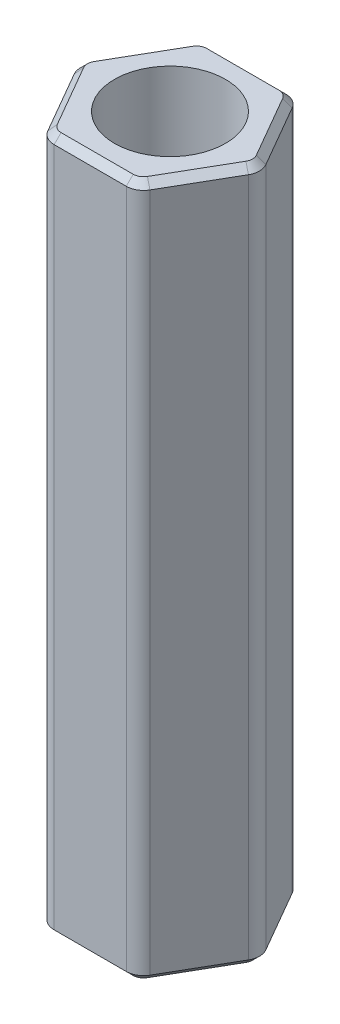
ISO-10303-21;
HEADER;
FILE_DESCRIPTION(('STEP AP214'),'2;1');
FILE_NAME('part.step','',(''),(''),'','','');
FILE_SCHEMA(('AUTOMOTIVE_DESIGN { 1 0 10303 214 1 1 1 1 }'));
ENDSEC;
DATA;
#1=APPLICATION_CONTEXT('core data for automotive mechanical design processes');
#2=APPLICATION_PROTOCOL_DEFINITION('international standard','automotive_design',2000,#1);
#3=PRODUCT_CONTEXT('',#1,'mechanical');
#4=PRODUCT('Part','Part','',(#3));
#5=PRODUCT_RELATED_PRODUCT_CATEGORY('part','',(#4));
#6=PRODUCT_DEFINITION_FORMATION('','',#4);
#7=PRODUCT_DEFINITION_CONTEXT('part definition',#1,'design');
#8=PRODUCT_DEFINITION('design','',#6,#7);
#9=PRODUCT_DEFINITION_SHAPE('','',#8);
#10=(LENGTH_UNIT() NAMED_UNIT(*) SI_UNIT(.MILLI.,.METRE.));
#11=(NAMED_UNIT(*) PLANE_ANGLE_UNIT() SI_UNIT($,.RADIAN.));
#12=(NAMED_UNIT(*) SI_UNIT($,.STERADIAN.) SOLID_ANGLE_UNIT());
#13=UNCERTAINTY_MEASURE_WITH_UNIT(LENGTH_MEASURE(1.E-05),#10,'distance_accuracy_value','');
#14=(GEOMETRIC_REPRESENTATION_CONTEXT(3) GLOBAL_UNCERTAINTY_ASSIGNED_CONTEXT((#13)) GLOBAL_UNIT_ASSIGNED_CONTEXT((#10,
#11,#12)) REPRESENTATION_CONTEXT('',''));
#15=CARTESIAN_POINT('',(0.,0.,0.));
#16=DIRECTION('',(0.,0.,1.));
#17=DIRECTION('',(1.,0.,0.));
#18=AXIS2_PLACEMENT_3D('',#15,#16,#17);
#19=CARTESIAN_POINT('',(-1.32790561913614,20.,2.3));
#20=DIRECTION('',(0.,0.,-1.));
#21=DIRECTION('',(-1.,0.,0.));
#22=AXIS2_PLACEMENT_3D('',#19,#20,#21);
#23=PLANE('',#22);
#24=DIRECTION('',(0.,-1.,0.));
#25=VECTOR('',#24,1.);
#26=CARTESIAN_POINT('',(1.03923048454133,20.,2.3));
#27=LINE('',#26,#25);
#28=CARTESIAN_POINT('',(1.03923048454133,0.200000000000002,2.3));
#29=VERTEX_POINT('',#28);
#30=CARTESIAN_POINT('',(1.03923048454133,19.8,2.3));
#31=VERTEX_POINT('',#30);
#32=EDGE_CURVE('E1073',#29,#31,#27,.F.);
#33=ORIENTED_EDGE('',*,*,#32,.T.);
#34=DIRECTION('',(-1.,0.,0.));
#35=VECTOR('',#34,1.);
#36=CARTESIAN_POINT('',(-1.03923048454132,19.8,2.3));
#37=LINE('',#36,#35);
#38=CARTESIAN_POINT('',(-1.03923048454132,19.8,2.3));
#39=VERTEX_POINT('',#38);
#40=EDGE_CURVE('E308',#31,#39,#37,.T.);
#41=ORIENTED_EDGE('',*,*,#40,.T.);
#42=DIRECTION('',(0.,-1.,0.));
#43=VECTOR('',#42,1.);
#44=CARTESIAN_POINT('',(-1.03923048454132,20.,2.3));
#45=LINE('',#44,#43);
#46=CARTESIAN_POINT('',(-1.03923048454132,0.200000000000002,2.3));
#47=VERTEX_POINT('',#46);
#48=EDGE_CURVE('E1078',#39,#47,#45,.T.);
#49=ORIENTED_EDGE('',*,*,#48,.T.);
#50=DIRECTION('',(1.,0.,0.));
#51=VECTOR('',#50,1.);
#52=CARTESIAN_POINT('',(-1.32790561913614,0.200000000000002,2.3));
#53=LINE('',#52,#51);
#54=EDGE_CURVE('E305',#47,#29,#53,.T.);
#55=ORIENTED_EDGE('',*,*,#54,.T.);
#56=EDGE_LOOP('',(#33,#41,#49,#55));
#57=FACE_BOUND('',#56,.T.);
#58=ADVANCED_FACE('F45',(#57),#23,.F.);
#59=CARTESIAN_POINT('',(1.32790561913614,20.,2.3));
#60=DIRECTION('',(-0.866025403784439,0.,-0.5));
#61=DIRECTION('',(-0.5,0.,0.866025403784439));
#62=AXIS2_PLACEMENT_3D('',#59,#60,#61);
#63=PLANE('',#62);
#64=DIRECTION('',(0.,-1.,0.));
#65=VECTOR('',#64,1.);
#66=CARTESIAN_POINT('',(2.51147367097487,20.,0.25));
#67=LINE('',#66,#65);
#68=CARTESIAN_POINT('',(2.51147367097487,0.200000000000002,0.25));
#69=VERTEX_POINT('',#68);
#70=CARTESIAN_POINT('',(2.51147367097487,19.8,0.25));
#71=VERTEX_POINT('',#70);
#72=EDGE_CURVE('E242',#69,#71,#67,.F.);
#73=ORIENTED_EDGE('',*,*,#72,.T.);
#74=DIRECTION('',(-0.5,0.,0.866025403784439));
#75=VECTOR('',#74,1.);
#76=CARTESIAN_POINT('',(1.47224318643355,19.8,2.05));
#77=LINE('',#76,#75);
#78=CARTESIAN_POINT('',(1.47224318643355,19.8,2.05));
#79=VERTEX_POINT('',#78);
#80=EDGE_CURVE('E332',#71,#79,#77,.T.);
#81=ORIENTED_EDGE('',*,*,#80,.T.);
#82=DIRECTION('',(0.,-1.,0.));
#83=VECTOR('',#82,1.);
#84=CARTESIAN_POINT('',(1.47224318643355,20.,2.05));
#85=LINE('',#84,#83);
#86=CARTESIAN_POINT('',(1.47224318643355,0.200000000000002,2.05));
#87=VERTEX_POINT('',#86);
#88=EDGE_CURVE('E248',#79,#87,#85,.T.);
#89=ORIENTED_EDGE('',*,*,#88,.T.);
#90=DIRECTION('',(0.5,0.,-0.866025403784439));
#91=VECTOR('',#90,1.);
#92=CARTESIAN_POINT('',(1.32790561913614,0.200000000000002,2.3));
#93=LINE('',#92,#91);
#94=EDGE_CURVE('E329',#87,#69,#93,.T.);
#95=ORIENTED_EDGE('',*,*,#94,.T.);
#96=EDGE_LOOP('',(#73,#81,#89,#95));
#97=FACE_BOUND('',#96,.T.);
#98=ADVANCED_FACE('F510',(#97),#63,.F.);
#99=CARTESIAN_POINT('',(2.65581123827228,20.,0.));
#100=DIRECTION('',(-0.866025403784438,0.,0.5));
#101=DIRECTION('',(0.5,0.,0.866025403784438));
#102=AXIS2_PLACEMENT_3D('',#99,#100,#101);
#103=PLANE('',#102);
#104=DIRECTION('',(0.,-1.,0.));
#105=VECTOR('',#104,1.);
#106=CARTESIAN_POINT('',(1.47224318643354,20.,-2.05));
#107=LINE('',#106,#105);
#108=CARTESIAN_POINT('',(1.47224318643354,0.200000000000002,-2.05));
#109=VERTEX_POINT('',#108);
#110=CARTESIAN_POINT('',(1.47224318643354,19.8,-2.05));
#111=VERTEX_POINT('',#110);
#112=EDGE_CURVE('E482',#109,#111,#107,.F.);
#113=ORIENTED_EDGE('',*,*,#112,.T.);
#114=DIRECTION('',(0.5,0.,0.866025403784438));
#115=VECTOR('',#114,1.);
#116=CARTESIAN_POINT('',(2.51147367097487,19.8,-0.25));
#117=LINE('',#116,#115);
#118=CARTESIAN_POINT('',(2.51147367097487,19.8,-0.25));
#119=VERTEX_POINT('',#118);
#120=EDGE_CURVE('E349',#111,#119,#117,.T.);
#121=ORIENTED_EDGE('',*,*,#120,.T.);
#122=DIRECTION('',(0.,-1.,0.));
#123=VECTOR('',#122,1.);
#124=CARTESIAN_POINT('',(2.51147367097487,20.,-0.25));
#125=LINE('',#124,#123);
#126=CARTESIAN_POINT('',(2.51147367097487,0.200000000000002,-0.25));
#127=VERTEX_POINT('',#126);
#128=EDGE_CURVE('E494',#119,#127,#125,.T.);
#129=ORIENTED_EDGE('',*,*,#128,.T.);
#130=DIRECTION('',(-0.5,0.,-0.866025403784438));
#131=VECTOR('',#130,1.);
#132=CARTESIAN_POINT('',(2.65581123827228,0.200000000000002,0.));
#133=LINE('',#132,#131);
#134=EDGE_CURVE('E346',#127,#109,#133,.T.);
#135=ORIENTED_EDGE('',*,*,#134,.T.);
#136=EDGE_LOOP('',(#113,#121,#129,#135));
#137=FACE_BOUND('',#136,.T.);
#138=ADVANCED_FACE('F535',(#137),#103,.F.);
#139=CARTESIAN_POINT('',(1.32790561913614,20.,-2.3));
#140=DIRECTION('',(0.,0.,1.));
#141=DIRECTION('',(1.,0.,0.));
#142=AXIS2_PLACEMENT_3D('',#139,#140,#141);
#143=PLANE('',#142);
#144=DIRECTION('',(0.,-1.,0.));
#145=VECTOR('',#144,1.);
#146=CARTESIAN_POINT('',(-1.03923048454133,20.,-2.3));
#147=LINE('',#146,#145);
#148=CARTESIAN_POINT('',(-1.03923048454133,0.200000000000002,-2.3));
#149=VERTEX_POINT('',#148);
#150=CARTESIAN_POINT('',(-1.03923048454133,19.8,-2.3));
#151=VERTEX_POINT('',#150);
#152=EDGE_CURVE('E489',#149,#151,#147,.F.);
#153=ORIENTED_EDGE('',*,*,#152,.T.);
#154=DIRECTION('',(1.,0.,0.));
#155=VECTOR('',#154,1.);
#156=CARTESIAN_POINT('',(1.03923048454133,19.8,-2.3));
#157=LINE('',#156,#155);
#158=CARTESIAN_POINT('',(1.03923048454133,19.8,-2.3));
#159=VERTEX_POINT('',#158);
#160=EDGE_CURVE('E282',#151,#159,#157,.T.);
#161=ORIENTED_EDGE('',*,*,#160,.T.);
#162=DIRECTION('',(0.,-1.,0.));
#163=VECTOR('',#162,1.);
#164=CARTESIAN_POINT('',(1.03923048454133,20.,-2.3));
#165=LINE('',#164,#163);
#166=CARTESIAN_POINT('',(1.03923048454133,0.200000000000002,-2.3));
#167=VERTEX_POINT('',#166);
#168=EDGE_CURVE('E480',#159,#167,#165,.T.);
#169=ORIENTED_EDGE('',*,*,#168,.T.);
#170=DIRECTION('',(-1.,0.,0.));
#171=VECTOR('',#170,1.);
#172=CARTESIAN_POINT('',(1.32790561913614,0.200000000000002,-2.3));
#173=LINE('',#172,#171);
#174=EDGE_CURVE('E279',#167,#149,#173,.T.);
#175=ORIENTED_EDGE('',*,*,#174,.T.);
#176=EDGE_LOOP('',(#153,#161,#169,#175));
#177=FACE_BOUND('',#176,.T.);
#178=ADVANCED_FACE('F485',(#177),#143,.F.);
#179=CARTESIAN_POINT('',(-1.32790561913614,20.,-2.3));
#180=DIRECTION('',(0.866025403784439,0.,0.5));
#181=DIRECTION('',(0.5,0.,-0.866025403784439));
#182=AXIS2_PLACEMENT_3D('',#179,#180,#181);
#183=PLANE('',#182);
#184=DIRECTION('',(0.,-1.,0.));
#185=VECTOR('',#184,1.);
#186=CARTESIAN_POINT('',(-2.51147367097487,20.,-0.25));
#187=LINE('',#186,#185);
#188=CARTESIAN_POINT('',(-2.51147367097487,0.200000000000002,-0.25));
#189=VERTEX_POINT('',#188);
#190=CARTESIAN_POINT('',(-2.51147367097487,19.8,-0.25));
#191=VERTEX_POINT('',#190);
#192=EDGE_CURVE('E490',#189,#191,#187,.F.);
#193=ORIENTED_EDGE('',*,*,#192,.T.);
#194=DIRECTION('',(0.5,0.,-0.866025403784439));
#195=VECTOR('',#194,1.);
#196=CARTESIAN_POINT('',(-1.47224318643355,19.8,-2.05));
#197=LINE('',#196,#195);
#198=CARTESIAN_POINT('',(-1.47224318643355,19.8,-2.05));
#199=VERTEX_POINT('',#198);
#200=EDGE_CURVE('E314',#191,#199,#197,.T.);
#201=ORIENTED_EDGE('',*,*,#200,.T.);
#202=DIRECTION('',(0.,-1.,0.));
#203=VECTOR('',#202,1.);
#204=CARTESIAN_POINT('',(-1.47224318643355,20.,-2.05));
#205=LINE('',#204,#203);
#206=CARTESIAN_POINT('',(-1.47224318643355,0.200000000000002,-2.05));
#207=VERTEX_POINT('',#206);
#208=EDGE_CURVE('E497',#199,#207,#205,.T.);
#209=ORIENTED_EDGE('',*,*,#208,.T.);
#210=DIRECTION('',(-0.5,0.,0.866025403784439));
#211=VECTOR('',#210,1.);
#212=CARTESIAN_POINT('',(-1.32790561913614,0.200000000000002,-2.3));
#213=LINE('',#212,#211);
#214=EDGE_CURVE('E311',#207,#189,#213,.T.);
#215=ORIENTED_EDGE('',*,*,#214,.T.);
#216=EDGE_LOOP('',(#193,#201,#209,#215));
#217=FACE_BOUND('',#216,.T.);
#218=ADVANCED_FACE('F873',(#217),#183,.F.);
#219=CARTESIAN_POINT('',(-2.65581123827228,20.,0.));
#220=DIRECTION('',(0.866025403784438,0.,-0.5));
#221=DIRECTION('',(-0.5,0.,-0.866025403784438));
#222=AXIS2_PLACEMENT_3D('',#219,#220,#221);
#223=PLANE('',#222);
#224=DIRECTION('',(0.,-1.,0.));
#225=VECTOR('',#224,1.);
#226=CARTESIAN_POINT('',(-1.47224318643354,20.,2.05));
#227=LINE('',#226,#225);
#228=CARTESIAN_POINT('',(-1.47224318643354,0.200000000000002,2.05));
#229=VERTEX_POINT('',#228);
#230=CARTESIAN_POINT('',(-1.47224318643354,19.8,2.05));
#231=VERTEX_POINT('',#230);
#232=EDGE_CURVE('E1086',#229,#231,#227,.F.);
#233=ORIENTED_EDGE('',*,*,#232,.T.);
#234=DIRECTION('',(-0.5,0.,-0.866025403784438));
#235=VECTOR('',#234,1.);
#236=CARTESIAN_POINT('',(-2.51147367097487,19.8,0.25));
#237=LINE('',#236,#235);
#238=CARTESIAN_POINT('',(-2.51147367097487,19.8,0.25));
#239=VERTEX_POINT('',#238);
#240=EDGE_CURVE('E289',#231,#239,#237,.T.);
#241=ORIENTED_EDGE('',*,*,#240,.T.);
#242=DIRECTION('',(0.,-1.,0.));
#243=VECTOR('',#242,1.);
#244=CARTESIAN_POINT('',(-2.51147367097487,20.,0.25));
#245=LINE('',#244,#243);
#246=CARTESIAN_POINT('',(-2.51147367097487,0.200000000000002,0.25));
#247=VERTEX_POINT('',#246);
#248=EDGE_CURVE('E1082',#239,#247,#245,.T.);
#249=ORIENTED_EDGE('',*,*,#248,.T.);
#250=DIRECTION('',(0.5,0.,0.866025403784438));
#251=VECTOR('',#250,1.);
#252=CARTESIAN_POINT('',(-2.65581123827228,0.200000000000002,0.));
#253=LINE('',#252,#251);
#254=EDGE_CURVE('E286',#247,#229,#253,.T.);
#255=ORIENTED_EDGE('',*,*,#254,.T.);
#256=EDGE_LOOP('',(#233,#241,#249,#255));
#257=FACE_BOUND('',#256,.T.);
#258=ADVANCED_FACE('F863',(#257),#223,.F.);
#259=CARTESIAN_POINT('',(0.,20.,0.));
#260=DIRECTION('',(0.,1.,0.));
#261=DIRECTION('',(0.,0.,1.));
#262=AXIS2_PLACEMENT_3D('',#259,#260,#261);
#263=PLANE('',#262);
#264=DIRECTION('',(-0.5,0.,0.866025403784439));
#265=VECTOR('',#264,1.);
#266=CARTESIAN_POINT('',(-2.33826859021799,20.,-0.150000000000001));
#267=LINE('',#266,#265);
#268=CARTESIAN_POINT('',(-1.29903810567666,20.,-1.95));
#269=VERTEX_POINT('',#268);
#270=CARTESIAN_POINT('',(-2.33826859021799,20.,-0.150000000000001));
#271=VERTEX_POINT('',#270);
#272=EDGE_CURVE('E273',#269,#271,#267,.T.);
#273=ORIENTED_EDGE('',*,*,#272,.T.);
#274=CARTESIAN_POINT('',(-2.07846096908265,20.,0.));
#275=DIRECTION('',(0.,1.,0.));
#276=DIRECTION('',(0.,0.,1.));
#277=AXIS2_PLACEMENT_3D('',#274,#275,#276);
#278=CIRCLE('',#277,0.300000000000002);
#279=CARTESIAN_POINT('',(-2.33826859021799,20.,0.150000000000001));
#280=VERTEX_POINT('',#279);
#281=EDGE_CURVE('E276',#271,#280,#278,.T.);
#282=ORIENTED_EDGE('',*,*,#281,.T.);
#283=DIRECTION('',(0.5,0.,0.866025403784439));
#284=VECTOR('',#283,1.);
#285=CARTESIAN_POINT('',(-1.29903810567666,20.,1.95));
#286=LINE('',#285,#284);
#287=CARTESIAN_POINT('',(-1.29903810567666,20.,1.95));
#288=VERTEX_POINT('',#287);
#289=EDGE_CURVE('E263',#280,#288,#286,.T.);
#290=ORIENTED_EDGE('',*,*,#289,.T.);
#291=CARTESIAN_POINT('',(-1.03923048454132,20.,1.8));
#292=DIRECTION('',(0.,1.,0.));
#293=DIRECTION('',(0.,0.,1.));
#294=AXIS2_PLACEMENT_3D('',#291,#292,#293);
#295=CIRCLE('',#294,0.300000000000002);
#296=CARTESIAN_POINT('',(-1.03923048454132,20.,2.1));
#297=VERTEX_POINT('',#296);
#298=EDGE_CURVE('E260',#288,#297,#295,.T.);
#299=ORIENTED_EDGE('',*,*,#298,.T.);
#300=DIRECTION('',(1.,0.,0.));
#301=VECTOR('',#300,1.);
#302=CARTESIAN_POINT('',(1.03923048454133,20.,2.1));
#303=LINE('',#302,#301);
#304=CARTESIAN_POINT('',(1.03923048454133,20.,2.1));
#305=VERTEX_POINT('',#304);
#306=EDGE_CURVE('E257',#297,#305,#303,.T.);
#307=ORIENTED_EDGE('',*,*,#306,.T.);
#308=CARTESIAN_POINT('',(1.03923048454133,20.,1.8));
#309=DIRECTION('',(0.,1.,0.));
#310=DIRECTION('',(0.,0.,1.));
#311=AXIS2_PLACEMENT_3D('',#308,#309,#310);
#312=CIRCLE('',#311,0.300000000000002);
#313=CARTESIAN_POINT('',(1.29903810567666,20.,1.95));
#314=VERTEX_POINT('',#313);
#315=EDGE_CURVE('E254',#305,#314,#312,.T.);
#316=ORIENTED_EDGE('',*,*,#315,.T.);
#317=DIRECTION('',(0.5,0.,-0.866025403784439));
#318=VECTOR('',#317,1.);
#319=CARTESIAN_POINT('',(2.33826859021799,20.,0.150000000000001));
#320=LINE('',#319,#318);
#321=CARTESIAN_POINT('',(2.33826859021799,20.,0.150000000000001));
#322=VERTEX_POINT('',#321);
#323=EDGE_CURVE('E219',#314,#322,#320,.T.);
#324=ORIENTED_EDGE('',*,*,#323,.T.);
#325=CARTESIAN_POINT('',(2.07846096908265,20.,0.));
#326=DIRECTION('',(0.,1.,0.));
#327=DIRECTION('',(0.,0.,1.));
#328=AXIS2_PLACEMENT_3D('',#325,#326,#327);
#329=CIRCLE('',#328,0.300000000000002);
#330=CARTESIAN_POINT('',(2.33826859021799,20.,-0.150000000000001));
#331=VERTEX_POINT('',#330);
#332=EDGE_CURVE('E211',#322,#331,#329,.T.);
#333=ORIENTED_EDGE('',*,*,#332,.T.);
#334=DIRECTION('',(-0.5,0.,-0.866025403784438));
#335=VECTOR('',#334,1.);
#336=CARTESIAN_POINT('',(1.29903810567666,20.,-1.95));
#337=LINE('',#336,#335);
#338=CARTESIAN_POINT('',(1.29903810567666,20.,-1.95));
#339=VERTEX_POINT('',#338);
#340=EDGE_CURVE('E216',#331,#339,#337,.T.);
#341=ORIENTED_EDGE('',*,*,#340,.T.);
#342=CARTESIAN_POINT('',(1.03923048454133,20.,-1.8));
#343=DIRECTION('',(0.,1.,0.));
#344=DIRECTION('',(0.,0.,1.));
#345=AXIS2_PLACEMENT_3D('',#342,#343,#344);
#346=CIRCLE('',#345,0.300000000000002);
#347=CARTESIAN_POINT('',(1.03923048454133,20.,-2.1));
#348=VERTEX_POINT('',#347);
#349=EDGE_CURVE('E224',#339,#348,#346,.T.);
#350=ORIENTED_EDGE('',*,*,#349,.T.);
#351=DIRECTION('',(-1.,0.,0.));
#352=VECTOR('',#351,1.);
#353=CARTESIAN_POINT('',(-1.03923048454133,20.,-2.1));
#354=LINE('',#353,#352);
#355=CARTESIAN_POINT('',(-1.03923048454133,20.,-2.1));
#356=VERTEX_POINT('',#355);
#357=EDGE_CURVE('E266',#348,#356,#354,.T.);
#358=ORIENTED_EDGE('',*,*,#357,.T.);
#359=CARTESIAN_POINT('',(-1.03923048454133,20.,-1.8));
#360=DIRECTION('',(0.,1.,0.));
#361=DIRECTION('',(0.,0.,1.));
#362=AXIS2_PLACEMENT_3D('',#359,#360,#361);
#363=CIRCLE('',#362,0.300000000000002);
#364=EDGE_CURVE('E270',#356,#269,#363,.T.);
#365=ORIENTED_EDGE('',*,*,#364,.T.);
#366=EDGE_LOOP('',(#273,#282,#290,#299,#307,#316,#324,#333,#341,#350,#358,#365));
#367=FACE_BOUND('',#366,.T.);
#368=CARTESIAN_POINT('',(0.,20.,0.));
#369=DIRECTION('',(0.,1.,0.));
#370=DIRECTION('',(0.,0.,1.));
#371=AXIS2_PLACEMENT_3D('',#368,#369,#370);
#372=CIRCLE('',#371,1.6);
#373=CARTESIAN_POINT('',(0.,20.,1.6));
#374=VERTEX_POINT('',#373);
#375=EDGE_CURVE('E420',#374,#374,#372,.T.);
#376=ORIENTED_EDGE('',*,*,#375,.F.);
#377=EDGE_LOOP('',(#376));
#378=FACE_BOUND('',#377,.T.);
#379=ADVANCED_FACE('F213',(#367,#378),#263,.T.);
#380=CARTESIAN_POINT('',(0.,0.,0.));
#381=DIRECTION('',(0.,1.,0.));
#382=DIRECTION('',(0.,0.,1.));
#383=AXIS2_PLACEMENT_3D('',#380,#381,#382);
#384=PLANE('',#383);
#385=DIRECTION('',(-1.,0.,0.));
#386=VECTOR('',#385,1.);
#387=CARTESIAN_POINT('',(0.,0.,2.1));
#388=LINE('',#387,#386);
#389=CARTESIAN_POINT('',(1.03923048454133,0.,2.1));
#390=VERTEX_POINT('',#389);
#391=CARTESIAN_POINT('',(-1.03923048454132,0.,2.1));
#392=VERTEX_POINT('',#391);
#393=EDGE_CURVE('E71',#390,#392,#388,.T.);
#394=ORIENTED_EDGE('',*,*,#393,.T.);
#395=CARTESIAN_POINT('',(-1.03923048454132,0.,1.8));
#396=DIRECTION('',(0.,1.,0.));
#397=DIRECTION('',(0.,0.,1.));
#398=AXIS2_PLACEMENT_3D('',#395,#396,#397);
#399=CIRCLE('',#398,0.3);
#400=CARTESIAN_POINT('',(-1.29903810567666,0.,1.95));
#401=VERTEX_POINT('',#400);
#402=EDGE_CURVE('E11',#392,#401,#399,.F.);
#403=ORIENTED_EDGE('',*,*,#402,.T.);
#404=DIRECTION('',(-0.5,0.,-0.866025403784439));
#405=VECTOR('',#404,1.);
#406=CARTESIAN_POINT('',(-1.81865334794732,0.,1.05));
#407=LINE('',#406,#405);
#408=CARTESIAN_POINT('',(-2.33826859021798,0.,0.15));
#409=VERTEX_POINT('',#408);
#410=EDGE_CURVE('E56',#401,#409,#407,.T.);
#411=ORIENTED_EDGE('',*,*,#410,.T.);
#412=CARTESIAN_POINT('',(-2.07846096908265,0.,0.));
#413=DIRECTION('',(0.,1.,0.));
#414=DIRECTION('',(0.,0.,1.));
#415=AXIS2_PLACEMENT_3D('',#412,#413,#414);
#416=CIRCLE('',#415,0.3);
#417=CARTESIAN_POINT('',(-2.33826859021798,0.,-0.15));
#418=VERTEX_POINT('',#417);
#419=EDGE_CURVE('E376',#409,#418,#416,.F.);
#420=ORIENTED_EDGE('',*,*,#419,.T.);
#421=DIRECTION('',(0.5,0.,-0.866025403784439));
#422=VECTOR('',#421,1.);
#423=CARTESIAN_POINT('',(-1.81865334794732,0.,-1.05));
#424=LINE('',#423,#422);
#425=CARTESIAN_POINT('',(-1.29903810567666,0.,-1.95));
#426=VERTEX_POINT('',#425);
#427=EDGE_CURVE('E370',#418,#426,#424,.T.);
#428=ORIENTED_EDGE('',*,*,#427,.T.);
#429=CARTESIAN_POINT('',(-1.03923048454133,0.,-1.8));
#430=DIRECTION('',(0.,1.,0.));
#431=DIRECTION('',(0.,0.,1.));
#432=AXIS2_PLACEMENT_3D('',#429,#430,#431);
#433=CIRCLE('',#432,0.3);
#434=CARTESIAN_POINT('',(-1.03923048454133,0.,-2.1));
#435=VERTEX_POINT('',#434);
#436=EDGE_CURVE('E364',#426,#435,#433,.F.);
#437=ORIENTED_EDGE('',*,*,#436,.T.);
#438=DIRECTION('',(1.,0.,0.));
#439=VECTOR('',#438,1.);
#440=CARTESIAN_POINT('',(0.,0.,-2.1));
#441=LINE('',#440,#439);
#442=CARTESIAN_POINT('',(1.03923048454133,0.,-2.1));
#443=VERTEX_POINT('',#442);
#444=EDGE_CURVE('E358',#435,#443,#441,.T.);
#445=ORIENTED_EDGE('',*,*,#444,.T.);
#446=CARTESIAN_POINT('',(1.03923048454133,0.,-1.8));
#447=DIRECTION('',(0.,1.,0.));
#448=DIRECTION('',(0.,0.,1.));
#449=AXIS2_PLACEMENT_3D('',#446,#447,#448);
#450=CIRCLE('',#449,0.3);
#451=CARTESIAN_POINT('',(1.29903810567666,0.,-1.95));
#452=VERTEX_POINT('',#451);
#453=EDGE_CURVE('E352',#443,#452,#450,.F.);
#454=ORIENTED_EDGE('',*,*,#453,.T.);
#455=DIRECTION('',(0.5,0.,0.866025403784438));
#456=VECTOR('',#455,1.);
#457=CARTESIAN_POINT('',(1.81865334794732,0.,-1.05));
#458=LINE('',#457,#456);
#459=CARTESIAN_POINT('',(2.33826859021799,0.,-0.15));
#460=VERTEX_POINT('',#459);
#461=EDGE_CURVE('E355',#452,#460,#458,.T.);
#462=ORIENTED_EDGE('',*,*,#461,.T.);
#463=CARTESIAN_POINT('',(2.07846096908265,0.,0.));
#464=DIRECTION('',(0.,1.,0.));
#465=DIRECTION('',(0.,0.,1.));
#466=AXIS2_PLACEMENT_3D('',#463,#464,#465);
#467=CIRCLE('',#466,0.3);
#468=CARTESIAN_POINT('',(2.33826859021798,0.,0.15));
#469=VERTEX_POINT('',#468);
#470=EDGE_CURVE('E361',#460,#469,#467,.F.);
#471=ORIENTED_EDGE('',*,*,#470,.T.);
#472=DIRECTION('',(-0.5,0.,0.866025403784439));
#473=VECTOR('',#472,1.);
#474=CARTESIAN_POINT('',(1.81865334794732,0.,1.05));
#475=LINE('',#474,#473);
#476=CARTESIAN_POINT('',(1.29903810567666,0.,1.95));
#477=VERTEX_POINT('',#476);
#478=EDGE_CURVE('E367',#469,#477,#475,.T.);
#479=ORIENTED_EDGE('',*,*,#478,.T.);
#480=CARTESIAN_POINT('',(1.03923048454133,0.,1.8));
#481=DIRECTION('',(0.,1.,0.));
#482=DIRECTION('',(0.,0.,1.));
#483=AXIS2_PLACEMENT_3D('',#480,#481,#482);
#484=CIRCLE('',#483,0.3);
#485=EDGE_CURVE('E373',#477,#390,#484,.F.);
#486=ORIENTED_EDGE('',*,*,#485,.T.);
#487=EDGE_LOOP('',(#394,#403,#411,#420,#428,#437,#445,#454,#462,#471,#479,#486));
#488=FACE_BOUND('',#487,.T.);
#489=CARTESIAN_POINT('',(0.,0.,0.));
#490=DIRECTION('',(0.,1.,0.));
#491=DIRECTION('',(0.,0.,1.));
#492=AXIS2_PLACEMENT_3D('',#489,#490,#491);
#493=CIRCLE('',#492,1.6);
#494=CARTESIAN_POINT('',(0.,0.,1.6));
#495=VERTEX_POINT('',#494);
#496=EDGE_CURVE('E1067',#495,#495,#493,.T.);
#497=ORIENTED_EDGE('',*,*,#496,.T.);
#498=EDGE_LOOP('',(#497));
#499=FACE_BOUND('',#498,.T.);
#500=ADVANCED_FACE('F525',(#488,#499),#384,.F.);
#501=CARTESIAN_POINT('',(0.,0.,0.));
#502=DIRECTION('',(0.,1.,0.));
#503=DIRECTION('',(0.,0.,1.));
#504=AXIS2_PLACEMENT_3D('',#501,#502,#503);
#505=CYLINDRICAL_SURFACE('',#504,1.6);
#506=ORIENTED_EDGE('',*,*,#496,.F.);
#507=EDGE_LOOP('',(#506));
#508=FACE_BOUND('',#507,.T.);
#509=ORIENTED_EDGE('',*,*,#375,.T.);
#510=EDGE_LOOP('',(#509));
#511=FACE_BOUND('',#510,.T.);
#512=ADVANCED_FACE('F603',(#508,#511),#505,.F.);
#513=CARTESIAN_POINT('',(-1.03923048454132,20.,1.8));
#514=DIRECTION('',(0.,-1.,0.));
#515=DIRECTION('',(0.,0.,-1.));
#516=AXIS2_PLACEMENT_3D('',#513,#514,#515);
#517=CYLINDRICAL_SURFACE('',#516,0.5);
#518=ORIENTED_EDGE('',*,*,#48,.F.);
#519=CARTESIAN_POINT('',(-1.03923048454132,19.8,1.8));
#520=DIRECTION('',(0.,1.,0.));
#521=DIRECTION('',(0.,0.,1.));
#522=AXIS2_PLACEMENT_3D('',#519,#520,#521);
#523=CIRCLE('',#522,0.5);
#524=EDGE_CURVE('E296',#39,#231,#523,.F.);
#525=ORIENTED_EDGE('',*,*,#524,.T.);
#526=ORIENTED_EDGE('',*,*,#232,.F.);
#527=CARTESIAN_POINT('',(-1.03923048454132,0.200000000000002,1.8));
#528=DIRECTION('',(0.,1.,0.));
#529=DIRECTION('',(0.,0.,1.));
#530=AXIS2_PLACEMENT_3D('',#527,#528,#529);
#531=CIRCLE('',#530,0.5);
#532=EDGE_CURVE('E292',#229,#47,#531,.T.);
#533=ORIENTED_EDGE('',*,*,#532,.T.);
#534=EDGE_LOOP('',(#518,#525,#526,#533));
#535=FACE_BOUND('',#534,.T.);
#536=ADVANCED_FACE('F599',(#535),#517,.T.);
#537=CARTESIAN_POINT('',(-2.07846096908265,20.,0.));
#538=DIRECTION('',(0.,-1.,0.));
#539=DIRECTION('',(0.,0.,-1.));
#540=AXIS2_PLACEMENT_3D('',#537,#538,#539);
#541=CYLINDRICAL_SURFACE('',#540,0.5);
#542=ORIENTED_EDGE('',*,*,#248,.F.);
#543=CARTESIAN_POINT('',(-2.07846096908265,19.8,0.));
#544=DIRECTION('',(0.,1.,0.));
#545=DIRECTION('',(0.,0.,1.));
#546=AXIS2_PLACEMENT_3D('',#543,#544,#545);
#547=CIRCLE('',#546,0.5);
#548=EDGE_CURVE('E302',#239,#191,#547,.F.);
#549=ORIENTED_EDGE('',*,*,#548,.T.);
#550=ORIENTED_EDGE('',*,*,#192,.F.);
#551=CARTESIAN_POINT('',(-2.07846096908265,0.200000000000002,0.));
#552=DIRECTION('',(0.,1.,0.));
#553=DIRECTION('',(0.,0.,1.));
#554=AXIS2_PLACEMENT_3D('',#551,#552,#553);
#555=CIRCLE('',#554,0.5);
#556=EDGE_CURVE('E299',#189,#247,#555,.T.);
#557=ORIENTED_EDGE('',*,*,#556,.T.);
#558=EDGE_LOOP('',(#542,#549,#550,#557));
#559=FACE_BOUND('',#558,.T.);
#560=ADVANCED_FACE('F602',(#559),#541,.T.);
#561=CARTESIAN_POINT('',(-1.03923048454133,20.,-1.8));
#562=DIRECTION('',(0.,-1.,0.));
#563=DIRECTION('',(0.,0.,-1.));
#564=AXIS2_PLACEMENT_3D('',#561,#562,#563);
#565=CYLINDRICAL_SURFACE('',#564,0.5);
#566=ORIENTED_EDGE('',*,*,#208,.F.);
#567=CARTESIAN_POINT('',(-1.03923048454133,19.8,-1.8));
#568=DIRECTION('',(0.,1.,0.));
#569=DIRECTION('',(0.,0.,1.));
#570=AXIS2_PLACEMENT_3D('',#567,#568,#569);
#571=CIRCLE('',#570,0.5);
#572=EDGE_CURVE('E326',#199,#151,#571,.F.);
#573=ORIENTED_EDGE('',*,*,#572,.T.);
#574=ORIENTED_EDGE('',*,*,#152,.F.);
#575=CARTESIAN_POINT('',(-1.03923048454133,0.200000000000002,-1.8));
#576=DIRECTION('',(0.,1.,0.));
#577=DIRECTION('',(0.,0.,1.));
#578=AXIS2_PLACEMENT_3D('',#575,#576,#577);
#579=CIRCLE('',#578,0.5);
#580=EDGE_CURVE('E323',#149,#207,#579,.T.);
#581=ORIENTED_EDGE('',*,*,#580,.T.);
#582=EDGE_LOOP('',(#566,#573,#574,#581));
#583=FACE_BOUND('',#582,.T.);
#584=ADVANCED_FACE('F607',(#583),#565,.T.);
#585=CARTESIAN_POINT('',(1.03923048454133,20.,-1.8));
#586=DIRECTION('',(0.,-1.,0.));
#587=DIRECTION('',(0.,0.,-1.));
#588=AXIS2_PLACEMENT_3D('',#585,#586,#587);
#589=CYLINDRICAL_SURFACE('',#588,0.5);
#590=ORIENTED_EDGE('',*,*,#168,.F.);
#591=CARTESIAN_POINT('',(1.03923048454133,19.8,-1.8));
#592=DIRECTION('',(0.,1.,0.));
#593=DIRECTION('',(0.,0.,1.));
#594=AXIS2_PLACEMENT_3D('',#591,#592,#593);
#595=CIRCLE('',#594,0.5);
#596=EDGE_CURVE('E343',#159,#111,#595,.F.);
#597=ORIENTED_EDGE('',*,*,#596,.T.);
#598=ORIENTED_EDGE('',*,*,#112,.F.);
#599=CARTESIAN_POINT('',(1.03923048454133,0.200000000000002,-1.8));
#600=DIRECTION('',(0.,1.,0.));
#601=DIRECTION('',(0.,0.,1.));
#602=AXIS2_PLACEMENT_3D('',#599,#600,#601);
#603=CIRCLE('',#602,0.5);
#604=EDGE_CURVE('E340',#109,#167,#603,.T.);
#605=ORIENTED_EDGE('',*,*,#604,.T.);
#606=EDGE_LOOP('',(#590,#597,#598,#605));
#607=FACE_BOUND('',#606,.T.);
#608=ADVANCED_FACE('F479',(#607),#589,.T.);
#609=CARTESIAN_POINT('',(2.07846096908265,20.,0.));
#610=DIRECTION('',(0.,-1.,0.));
#611=DIRECTION('',(0.,0.,-1.));
#612=AXIS2_PLACEMENT_3D('',#609,#610,#611);
#613=CYLINDRICAL_SURFACE('',#612,0.5);
#614=ORIENTED_EDGE('',*,*,#128,.F.);
#615=CARTESIAN_POINT('',(2.07846096908265,19.8,0.));
#616=DIRECTION('',(0.,1.,0.));
#617=DIRECTION('',(0.,0.,1.));
#618=AXIS2_PLACEMENT_3D('',#615,#616,#617);
#619=CIRCLE('',#618,0.5);
#620=EDGE_CURVE('E230',#119,#71,#619,.F.);
#621=ORIENTED_EDGE('',*,*,#620,.T.);
#622=ORIENTED_EDGE('',*,*,#72,.F.);
#623=CARTESIAN_POINT('',(2.07846096908265,0.200000000000002,0.));
#624=DIRECTION('',(0.,1.,0.));
#625=DIRECTION('',(0.,0.,1.));
#626=AXIS2_PLACEMENT_3D('',#623,#624,#625);
#627=CIRCLE('',#626,0.5);
#628=EDGE_CURVE('E335',#69,#127,#627,.T.);
#629=ORIENTED_EDGE('',*,*,#628,.T.);
#630=EDGE_LOOP('',(#614,#621,#622,#629));
#631=FACE_BOUND('',#630,.T.);
#632=ADVANCED_FACE('F533',(#631),#613,.T.);
#633=CARTESIAN_POINT('',(1.03923048454133,20.,1.8));
#634=DIRECTION('',(0.,-1.,0.));
#635=DIRECTION('',(0.,0.,-1.));
#636=AXIS2_PLACEMENT_3D('',#633,#634,#635);
#637=CYLINDRICAL_SURFACE('',#636,0.5);
#638=ORIENTED_EDGE('',*,*,#88,.F.);
#639=CARTESIAN_POINT('',(1.03923048454133,19.8,1.8));
#640=DIRECTION('',(0.,1.,0.));
#641=DIRECTION('',(0.,0.,1.));
#642=AXIS2_PLACEMENT_3D('',#639,#640,#641);
#643=CIRCLE('',#642,0.5);
#644=EDGE_CURVE('E320',#79,#31,#643,.F.);
#645=ORIENTED_EDGE('',*,*,#644,.T.);
#646=ORIENTED_EDGE('',*,*,#32,.F.);
#647=CARTESIAN_POINT('',(1.03923048454133,0.200000000000002,1.8));
#648=DIRECTION('',(0.,1.,0.));
#649=DIRECTION('',(0.,0.,1.));
#650=AXIS2_PLACEMENT_3D('',#647,#648,#649);
#651=CIRCLE('',#650,0.5);
#652=EDGE_CURVE('E317',#29,#87,#651,.T.);
#653=ORIENTED_EDGE('',*,*,#652,.T.);
#654=EDGE_LOOP('',(#638,#645,#646,#653));
#655=FACE_BOUND('',#654,.T.);
#656=ADVANCED_FACE('F616',(#655),#637,.T.);
#657=CARTESIAN_POINT('',(0.,20.,2.1));
#658=DIRECTION('',(0.,0.707106781186547,0.707106781186548));
#659=DIRECTION('',(-1.,0.,0.));
#660=AXIS2_PLACEMENT_3D('',#657,#658,#659);
#661=PLANE('',#660);
#662=DIRECTION('',(0.,0.707106781186548,-0.707106781186547));
#663=VECTOR('',#662,1.);
#664=CARTESIAN_POINT('',(-1.03923048454132,19.8,2.3));
#665=LINE('',#664,#663);
#666=EDGE_CURVE('E412',#39,#297,#665,.T.);
#667=ORIENTED_EDGE('',*,*,#666,.F.);
#668=ORIENTED_EDGE('',*,*,#40,.F.);
#669=DIRECTION('',(0.,-0.707106781186548,0.707106781186547));
#670=VECTOR('',#669,1.);
#671=CARTESIAN_POINT('',(1.03923048454133,20.,2.1));
#672=LINE('',#671,#670);
#673=EDGE_CURVE('E416',#305,#31,#672,.T.);
#674=ORIENTED_EDGE('',*,*,#673,.F.);
#675=ORIENTED_EDGE('',*,*,#306,.F.);
#676=EDGE_LOOP('',(#667,#668,#674,#675));
#677=FACE_BOUND('',#676,.T.);
#678=ADVANCED_FACE('F572',(#677),#661,.T.);
#679=CARTESIAN_POINT('',(1.03923048454133,20.,1.8));
#680=DIRECTION('',(0.,-1.,0.));
#681=DIRECTION('',(0.,0.,-1.));
#682=AXIS2_PLACEMENT_3D('',#679,#680,#681);
#683=CONICAL_SURFACE('',#682,0.300000000000002,0.785398163397447);
#684=ORIENTED_EDGE('',*,*,#673,.T.);
#685=ORIENTED_EDGE('',*,*,#644,.F.);
#686=DIRECTION('',(0.612372435695794,-0.707106781186548,0.353553390593273));
#687=VECTOR('',#686,1.);
#688=CARTESIAN_POINT('',(1.29903810567666,20.,1.95));
#689=LINE('',#688,#687);
#690=EDGE_CURVE('E408',#314,#79,#689,.T.);
#691=ORIENTED_EDGE('',*,*,#690,.F.);
#692=ORIENTED_EDGE('',*,*,#315,.F.);
#693=EDGE_LOOP('',(#684,#685,#691,#692));
#694=FACE_BOUND('',#693,.T.);
#695=ADVANCED_FACE('F577',(#694),#683,.T.);
#696=CARTESIAN_POINT('',(-1.03923048454132,20.,1.8));
#697=DIRECTION('',(0.,-1.,0.));
#698=DIRECTION('',(0.,0.,-1.));
#699=AXIS2_PLACEMENT_3D('',#696,#697,#698);
#700=CONICAL_SURFACE('',#699,0.300000000000002,0.785398163397447);
#701=ORIENTED_EDGE('',*,*,#666,.T.);
#702=ORIENTED_EDGE('',*,*,#298,.F.);
#703=DIRECTION('',(0.612372435695794,0.707106781186548,-0.353553390593273));
#704=VECTOR('',#703,1.);
#705=CARTESIAN_POINT('',(-1.47224318643354,19.8,2.05));
#706=LINE('',#705,#704);
#707=EDGE_CURVE('E404',#231,#288,#706,.T.);
#708=ORIENTED_EDGE('',*,*,#707,.F.);
#709=ORIENTED_EDGE('',*,*,#524,.F.);
#710=EDGE_LOOP('',(#701,#702,#708,#709));
#711=FACE_BOUND('',#710,.T.);
#712=ADVANCED_FACE('F567',(#711),#700,.T.);
#713=CARTESIAN_POINT('',(1.81865334794732,20.,1.05));
#714=DIRECTION('',(0.612372435695796,0.707106781186546,0.353553390593274));
#715=DIRECTION('',(-0.5,0.,0.866025403784439));
#716=AXIS2_PLACEMENT_3D('',#713,#714,#715);
#717=PLANE('',#716);
#718=ORIENTED_EDGE('',*,*,#690,.T.);
#719=ORIENTED_EDGE('',*,*,#80,.F.);
#720=DIRECTION('',(0.612372435695793,-0.707106781186549,0.353553390593274));
#721=VECTOR('',#720,1.);
#722=CARTESIAN_POINT('',(2.33826859021799,20.,0.150000000000001));
#723=LINE('',#722,#721);
#724=EDGE_CURVE('E401',#322,#71,#723,.T.);
#725=ORIENTED_EDGE('',*,*,#724,.F.);
#726=ORIENTED_EDGE('',*,*,#323,.F.);
#727=EDGE_LOOP('',(#718,#719,#725,#726));
#728=FACE_BOUND('',#727,.T.);
#729=ADVANCED_FACE('F579',(#728),#717,.T.);
#730=CARTESIAN_POINT('',(-1.81865334794732,20.,1.05));
#731=DIRECTION('',(-0.612372435695795,0.707106781186546,0.353553390593275));
#732=DIRECTION('',(-0.5,0.,-0.866025403784438));
#733=AXIS2_PLACEMENT_3D('',#730,#731,#732);
#734=PLANE('',#733);
#735=ORIENTED_EDGE('',*,*,#707,.T.);
#736=ORIENTED_EDGE('',*,*,#289,.F.);
#737=DIRECTION('',(0.612372435695793,0.707106781186549,-0.353553390593274));
#738=VECTOR('',#737,1.);
#739=CARTESIAN_POINT('',(-2.51147367097487,19.8,0.25));
#740=LINE('',#739,#738);
#741=EDGE_CURVE('E234',#239,#280,#740,.T.);
#742=ORIENTED_EDGE('',*,*,#741,.F.);
#743=ORIENTED_EDGE('',*,*,#240,.F.);
#744=EDGE_LOOP('',(#735,#736,#742,#743));
#745=FACE_BOUND('',#744,.T.);
#746=ADVANCED_FACE('F562',(#745),#734,.T.);
#747=CARTESIAN_POINT('',(2.07846096908265,20.,0.));
#748=DIRECTION('',(0.,-1.,0.));
#749=DIRECTION('',(0.,0.,-1.));
#750=AXIS2_PLACEMENT_3D('',#747,#748,#749);
#751=CONICAL_SURFACE('',#750,0.300000000000002,0.785398163397447);
#752=ORIENTED_EDGE('',*,*,#724,.T.);
#753=ORIENTED_EDGE('',*,*,#620,.F.);
#754=DIRECTION('',(0.612372435695793,-0.707106781186549,-0.353553390593274));
#755=VECTOR('',#754,1.);
#756=CARTESIAN_POINT('',(2.33826859021799,20.,-0.150000000000001));
#757=LINE('',#756,#755);
#758=EDGE_CURVE('E228',#331,#119,#757,.T.);
#759=ORIENTED_EDGE('',*,*,#758,.F.);
#760=ORIENTED_EDGE('',*,*,#332,.F.);
#761=EDGE_LOOP('',(#752,#753,#759,#760));
#762=FACE_BOUND('',#761,.T.);
#763=ADVANCED_FACE('F229',(#762),#751,.T.);
#764=CARTESIAN_POINT('',(-2.07846096908265,20.,0.));
#765=DIRECTION('',(0.,-1.,0.));
#766=DIRECTION('',(0.,0.,-1.));
#767=AXIS2_PLACEMENT_3D('',#764,#765,#766);
#768=CONICAL_SURFACE('',#767,0.300000000000002,0.785398163397447);
#769=ORIENTED_EDGE('',*,*,#741,.T.);
#770=ORIENTED_EDGE('',*,*,#281,.F.);
#771=DIRECTION('',(0.612372435695793,0.707106781186549,0.353553390593274));
#772=VECTOR('',#771,1.);
#773=CARTESIAN_POINT('',(-2.51147367097487,19.8,-0.25));
#774=LINE('',#773,#772);
#775=EDGE_CURVE('E235',#191,#271,#774,.T.);
#776=ORIENTED_EDGE('',*,*,#775,.F.);
#777=ORIENTED_EDGE('',*,*,#548,.F.);
#778=EDGE_LOOP('',(#769,#770,#776,#777));
#779=FACE_BOUND('',#778,.T.);
#780=ADVANCED_FACE('F557',(#779),#768,.T.);
#781=CARTESIAN_POINT('',(1.81865334794732,20.,-1.05));
#782=DIRECTION('',(0.612372435695796,0.707106781186545,-0.353553390593275));
#783=DIRECTION('',(0.5,0.,0.866025403784438));
#784=AXIS2_PLACEMENT_3D('',#781,#782,#783);
#785=PLANE('',#784);
#786=ORIENTED_EDGE('',*,*,#758,.T.);
#787=ORIENTED_EDGE('',*,*,#120,.F.);
#788=DIRECTION('',(0.612372435695793,-0.707106781186549,-0.353553390593274));
#789=VECTOR('',#788,1.);
#790=CARTESIAN_POINT('',(1.29903810567666,20.,-1.95));
#791=LINE('',#790,#789);
#792=EDGE_CURVE('E239',#339,#111,#791,.T.);
#793=ORIENTED_EDGE('',*,*,#792,.F.);
#794=ORIENTED_EDGE('',*,*,#340,.F.);
#795=EDGE_LOOP('',(#786,#787,#793,#794));
#796=FACE_BOUND('',#795,.T.);
#797=ADVANCED_FACE('F237',(#796),#785,.T.);
#798=CARTESIAN_POINT('',(-1.81865334794732,20.,-1.05));
#799=DIRECTION('',(-0.612372435695795,0.707106781186547,-0.353553390593274));
#800=DIRECTION('',(0.5,0.,-0.866025403784439));
#801=AXIS2_PLACEMENT_3D('',#798,#799,#800);
#802=PLANE('',#801);
#803=ORIENTED_EDGE('',*,*,#775,.T.);
#804=ORIENTED_EDGE('',*,*,#272,.F.);
#805=DIRECTION('',(0.612372435695794,0.707106781186548,0.353553390593273));
#806=VECTOR('',#805,1.);
#807=CARTESIAN_POINT('',(-1.47224318643355,19.8,-2.05));
#808=LINE('',#807,#806);
#809=EDGE_CURVE('E389',#199,#269,#808,.T.);
#810=ORIENTED_EDGE('',*,*,#809,.F.);
#811=ORIENTED_EDGE('',*,*,#200,.F.);
#812=EDGE_LOOP('',(#803,#804,#810,#811));
#813=FACE_BOUND('',#812,.T.);
#814=ADVANCED_FACE('F552',(#813),#802,.T.);
#815=CARTESIAN_POINT('',(1.03923048454133,20.,-1.8));
#816=DIRECTION('',(0.,-1.,0.));
#817=DIRECTION('',(0.,0.,-1.));
#818=AXIS2_PLACEMENT_3D('',#815,#816,#817);
#819=CONICAL_SURFACE('',#818,0.300000000000002,0.785398163397447);
#820=ORIENTED_EDGE('',*,*,#792,.T.);
#821=ORIENTED_EDGE('',*,*,#596,.F.);
#822=DIRECTION('',(0.,-0.707106781186548,-0.707106781186547));
#823=VECTOR('',#822,1.);
#824=CARTESIAN_POINT('',(1.03923048454133,20.,-2.1));
#825=LINE('',#824,#823);
#826=EDGE_CURVE('E386',#348,#159,#825,.T.);
#827=ORIENTED_EDGE('',*,*,#826,.F.);
#828=ORIENTED_EDGE('',*,*,#349,.F.);
#829=EDGE_LOOP('',(#820,#821,#827,#828));
#830=FACE_BOUND('',#829,.T.);
#831=ADVANCED_FACE('F538',(#830),#819,.T.);
#832=CARTESIAN_POINT('',(-1.03923048454133,20.,-1.8));
#833=DIRECTION('',(0.,-1.,0.));
#834=DIRECTION('',(0.,0.,-1.));
#835=AXIS2_PLACEMENT_3D('',#832,#833,#834);
#836=CONICAL_SURFACE('',#835,0.300000000000002,0.785398163397447);
#837=ORIENTED_EDGE('',*,*,#809,.T.);
#838=ORIENTED_EDGE('',*,*,#364,.F.);
#839=DIRECTION('',(0.,0.707106781186548,0.707106781186547));
#840=VECTOR('',#839,1.);
#841=CARTESIAN_POINT('',(-1.03923048454133,19.8,-2.3));
#842=LINE('',#841,#840);
#843=EDGE_CURVE('E383',#151,#356,#842,.T.);
#844=ORIENTED_EDGE('',*,*,#843,.F.);
#845=ORIENTED_EDGE('',*,*,#572,.F.);
#846=EDGE_LOOP('',(#837,#838,#844,#845));
#847=FACE_BOUND('',#846,.T.);
#848=ADVANCED_FACE('F548',(#847),#836,.T.);
#849=CARTESIAN_POINT('',(0.,20.,-2.1));
#850=DIRECTION('',(0.,0.707106781186544,-0.707106781186551));
#851=DIRECTION('',(1.,0.,0.));
#852=AXIS2_PLACEMENT_3D('',#849,#850,#851);
#853=PLANE('',#852);
#854=ORIENTED_EDGE('',*,*,#826,.T.);
#855=ORIENTED_EDGE('',*,*,#160,.F.);
#856=ORIENTED_EDGE('',*,*,#843,.T.);
#857=ORIENTED_EDGE('',*,*,#357,.F.);
#858=EDGE_LOOP('',(#854,#855,#856,#857));
#859=FACE_BOUND('',#858,.T.);
#860=ADVANCED_FACE('F544',(#859),#853,.T.);
#861=CARTESIAN_POINT('',(1.03923048454133,0.,-1.8));
#862=DIRECTION('',(0.,1.,0.));
#863=DIRECTION('',(0.,0.,1.));
#864=AXIS2_PLACEMENT_3D('',#861,#862,#863);
#865=CONICAL_SURFACE('',#864,0.3,0.785398163397442);
#866=DIRECTION('',(0.,-0.707106781186552,0.707106781186543));
#867=VECTOR('',#866,1.);
#868=CARTESIAN_POINT('',(1.03923048454133,0.200000000000002,-2.3));
#869=LINE('',#868,#867);
#870=EDGE_CURVE('E457',#167,#443,#869,.T.);
#871=ORIENTED_EDGE('',*,*,#870,.F.);
#872=ORIENTED_EDGE('',*,*,#604,.F.);
#873=DIRECTION('',(0.61237243569579,0.707106781186552,-0.353553390593272));
#874=VECTOR('',#873,1.);
#875=CARTESIAN_POINT('',(1.29903810567666,0.,-1.95));
#876=LINE('',#875,#874);
#877=EDGE_CURVE('E50',#452,#109,#876,.T.);
#878=ORIENTED_EDGE('',*,*,#877,.F.);
#879=ORIENTED_EDGE('',*,*,#453,.F.);
#880=EDGE_LOOP('',(#871,#872,#878,#879));
#881=FACE_BOUND('',#880,.T.);
#882=ADVANCED_FACE('F48',(#881),#865,.T.);
#883=CARTESIAN_POINT('',(2.65581123827228,0.200000000000002,0.));
#884=DIRECTION('',(-0.612372435695799,0.707106781186542,0.353553390593277));
#885=DIRECTION('',(-0.5,0.,-0.866025403784438));
#886=AXIS2_PLACEMENT_3D('',#883,#884,#885);
#887=PLANE('',#886);
#888=ORIENTED_EDGE('',*,*,#877,.T.);
#889=ORIENTED_EDGE('',*,*,#134,.F.);
#890=DIRECTION('',(0.612372435695789,0.707106781186553,-0.353553390593272));
#891=VECTOR('',#890,1.);
#892=CARTESIAN_POINT('',(2.33826859021799,0.,-0.15));
#893=LINE('',#892,#891);
#894=EDGE_CURVE('E454',#460,#127,#893,.T.);
#895=ORIENTED_EDGE('',*,*,#894,.F.);
#896=ORIENTED_EDGE('',*,*,#461,.F.);
#897=EDGE_LOOP('',(#888,#889,#895,#896));
#898=FACE_BOUND('',#897,.T.);
#899=ADVANCED_FACE('F470',(#898),#887,.F.);
#900=CARTESIAN_POINT('',(1.32790561913614,0.200000000000002,-2.3));
#901=DIRECTION('',(0.,0.707106781186543,0.707106781186552));
#902=DIRECTION('',(-1.,0.,0.));
#903=AXIS2_PLACEMENT_3D('',#900,#901,#902);
#904=PLANE('',#903);
#905=ORIENTED_EDGE('',*,*,#870,.T.);
#906=ORIENTED_EDGE('',*,*,#444,.F.);
#907=DIRECTION('',(0.,-0.707106781186552,0.707106781186543));
#908=VECTOR('',#907,1.);
#909=CARTESIAN_POINT('',(-1.03923048454133,0.200000000000002,-2.3));
#910=LINE('',#909,#908);
#911=EDGE_CURVE('E450',#149,#435,#910,.T.);
#912=ORIENTED_EDGE('',*,*,#911,.F.);
#913=ORIENTED_EDGE('',*,*,#174,.F.);
#914=EDGE_LOOP('',(#905,#906,#912,#913));
#915=FACE_BOUND('',#914,.T.);
#916=ADVANCED_FACE('F728',(#915),#904,.F.);
#917=CARTESIAN_POINT('',(2.07846096908265,0.,0.));
#918=DIRECTION('',(0.,1.,0.));
#919=DIRECTION('',(0.,0.,1.));
#920=AXIS2_PLACEMENT_3D('',#917,#918,#919);
#921=CONICAL_SURFACE('',#920,0.3,0.785398163397442);
#922=ORIENTED_EDGE('',*,*,#894,.T.);
#923=ORIENTED_EDGE('',*,*,#628,.F.);
#924=DIRECTION('',(0.61237243569579,0.707106781186552,0.353553390593272));
#925=VECTOR('',#924,1.);
#926=CARTESIAN_POINT('',(2.33826859021798,0.,0.15));
#927=LINE('',#926,#925);
#928=EDGE_CURVE('E446',#469,#69,#927,.T.);
#929=ORIENTED_EDGE('',*,*,#928,.F.);
#930=ORIENTED_EDGE('',*,*,#470,.F.);
#931=EDGE_LOOP('',(#922,#923,#929,#930));
#932=FACE_BOUND('',#931,.T.);
#933=ADVANCED_FACE('F530',(#932),#921,.T.);
#934=CARTESIAN_POINT('',(-1.03923048454133,0.,-1.8));
#935=DIRECTION('',(0.,1.,0.));
#936=DIRECTION('',(0.,0.,1.));
#937=AXIS2_PLACEMENT_3D('',#934,#935,#936);
#938=CONICAL_SURFACE('',#937,0.3,0.785398163397442);
#939=ORIENTED_EDGE('',*,*,#911,.T.);
#940=ORIENTED_EDGE('',*,*,#436,.F.);
#941=DIRECTION('',(0.612372435695791,-0.707106781186552,0.353553390593271));
#942=VECTOR('',#941,1.);
#943=CARTESIAN_POINT('',(-1.47224318643355,0.200000000000002,-2.05));
#944=LINE('',#943,#942);
#945=EDGE_CURVE('E442',#207,#426,#944,.T.);
#946=ORIENTED_EDGE('',*,*,#945,.F.);
#947=ORIENTED_EDGE('',*,*,#580,.F.);
#948=EDGE_LOOP('',(#939,#940,#946,#947));
#949=FACE_BOUND('',#948,.T.);
#950=ADVANCED_FACE('F716',(#949),#938,.T.);
#951=CARTESIAN_POINT('',(1.32790561913614,0.200000000000002,2.3));
#952=DIRECTION('',(-0.612372435695798,0.707106781186543,-0.353553390593276));
#953=DIRECTION('',(0.5,0.,-0.866025403784439));
#954=AXIS2_PLACEMENT_3D('',#951,#952,#953);
#955=PLANE('',#954);
#956=ORIENTED_EDGE('',*,*,#928,.T.);
#957=ORIENTED_EDGE('',*,*,#94,.F.);
#958=DIRECTION('',(0.612372435695791,0.707106781186551,0.353553390593272));
#959=VECTOR('',#958,1.);
#960=CARTESIAN_POINT('',(1.29903810567666,0.,1.95));
#961=LINE('',#960,#959);
#962=EDGE_CURVE('E438',#477,#87,#961,.T.);
#963=ORIENTED_EDGE('',*,*,#962,.F.);
#964=ORIENTED_EDGE('',*,*,#478,.F.);
#965=EDGE_LOOP('',(#956,#957,#963,#964));
#966=FACE_BOUND('',#965,.T.);
#967=ADVANCED_FACE('F517',(#966),#955,.F.);
#968=CARTESIAN_POINT('',(-1.32790561913614,0.200000000000002,-2.3));
#969=DIRECTION('',(0.612372435695798,0.707106781186544,0.353553390593276));
#970=DIRECTION('',(-0.5,0.,0.866025403784439));
#971=AXIS2_PLACEMENT_3D('',#968,#969,#970);
#972=PLANE('',#971);
#973=ORIENTED_EDGE('',*,*,#945,.T.);
#974=ORIENTED_EDGE('',*,*,#427,.F.);
#975=DIRECTION('',(0.61237243569579,-0.707106781186552,0.353553390593272));
#976=VECTOR('',#975,1.);
#977=CARTESIAN_POINT('',(-2.51147367097487,0.200000000000002,-0.25));
#978=LINE('',#977,#976);
#979=EDGE_CURVE('E434',#189,#418,#978,.T.);
#980=ORIENTED_EDGE('',*,*,#979,.F.);
#981=ORIENTED_EDGE('',*,*,#214,.F.);
#982=EDGE_LOOP('',(#973,#974,#980,#981));
#983=FACE_BOUND('',#982,.T.);
#984=ADVANCED_FACE('F704',(#983),#972,.F.);
#985=CARTESIAN_POINT('',(1.03923048454133,0.,1.8));
#986=DIRECTION('',(0.,1.,0.));
#987=DIRECTION('',(0.,0.,1.));
#988=AXIS2_PLACEMENT_3D('',#985,#986,#987);
#989=CONICAL_SURFACE('',#988,0.3,0.785398163397442);
#990=ORIENTED_EDGE('',*,*,#962,.T.);
#991=ORIENTED_EDGE('',*,*,#652,.F.);
#992=DIRECTION('',(0.,0.707106781186552,0.707106781186543));
#993=VECTOR('',#992,1.);
#994=CARTESIAN_POINT('',(1.03923048454133,0.,2.1));
#995=LINE('',#994,#993);
#996=EDGE_CURVE('E430',#390,#29,#995,.T.);
#997=ORIENTED_EDGE('',*,*,#996,.F.);
#998=ORIENTED_EDGE('',*,*,#485,.F.);
#999=EDGE_LOOP('',(#990,#991,#997,#998));
#1000=FACE_BOUND('',#999,.T.);
#1001=ADVANCED_FACE('F523',(#1000),#989,.T.);
#1002=CARTESIAN_POINT('',(-2.07846096908265,0.,0.));
#1003=DIRECTION('',(0.,1.,0.));
#1004=DIRECTION('',(0.,0.,1.));
#1005=AXIS2_PLACEMENT_3D('',#1002,#1003,#1004);
#1006=CONICAL_SURFACE('',#1005,0.3,0.785398163397442);
#1007=ORIENTED_EDGE('',*,*,#979,.T.);
#1008=ORIENTED_EDGE('',*,*,#419,.F.);
#1009=DIRECTION('',(0.61237243569579,-0.707106781186552,-0.353553390593272));
#1010=VECTOR('',#1009,1.);
#1011=CARTESIAN_POINT('',(-2.51147367097487,0.200000000000002,0.25));
#1012=LINE('',#1011,#1010);
#1013=EDGE_CURVE('E426',#247,#409,#1012,.T.);
#1014=ORIENTED_EDGE('',*,*,#1013,.F.);
#1015=ORIENTED_EDGE('',*,*,#556,.F.);
#1016=EDGE_LOOP('',(#1007,#1008,#1014,#1015));
#1017=FACE_BOUND('',#1016,.T.);
#1018=ADVANCED_FACE('F691',(#1017),#1006,.T.);
#1019=CARTESIAN_POINT('',(-1.32790561913614,0.200000000000002,2.3));
#1020=DIRECTION('',(0.,0.707106781186543,-0.707106781186552));
#1021=DIRECTION('',(1.,0.,0.));
#1022=AXIS2_PLACEMENT_3D('',#1019,#1020,#1021);
#1023=PLANE('',#1022);
#1024=ORIENTED_EDGE('',*,*,#996,.T.);
#1025=ORIENTED_EDGE('',*,*,#54,.F.);
#1026=DIRECTION('',(0.,0.707106781186552,0.707106781186543));
#1027=VECTOR('',#1026,1.);
#1028=CARTESIAN_POINT('',(-1.03923048454132,0.,2.1));
#1029=LINE('',#1028,#1027);
#1030=EDGE_CURVE('E423',#392,#47,#1029,.T.);
#1031=ORIENTED_EDGE('',*,*,#1030,.F.);
#1032=ORIENTED_EDGE('',*,*,#393,.F.);
#1033=EDGE_LOOP('',(#1024,#1025,#1031,#1032));
#1034=FACE_BOUND('',#1033,.T.);
#1035=ADVANCED_FACE('F684',(#1034),#1023,.F.);
#1036=CARTESIAN_POINT('',(-2.65581123827228,0.200000000000002,0.));
#1037=DIRECTION('',(0.612372435695799,0.707106781186543,-0.353553390593277));
#1038=DIRECTION('',(0.5,0.,0.866025403784438));
#1039=AXIS2_PLACEMENT_3D('',#1036,#1037,#1038);
#1040=PLANE('',#1039);
#1041=ORIENTED_EDGE('',*,*,#1013,.T.);
#1042=ORIENTED_EDGE('',*,*,#410,.F.);
#1043=DIRECTION('',(0.61237243569579,-0.707106781186553,-0.353553390593271));
#1044=VECTOR('',#1043,1.);
#1045=CARTESIAN_POINT('',(-1.47224318643354,0.200000000000002,2.05));
#1046=LINE('',#1045,#1044);
#1047=EDGE_CURVE('E64',#229,#401,#1046,.T.);
#1048=ORIENTED_EDGE('',*,*,#1047,.F.);
#1049=ORIENTED_EDGE('',*,*,#254,.F.);
#1050=EDGE_LOOP('',(#1041,#1042,#1048,#1049));
#1051=FACE_BOUND('',#1050,.T.);
#1052=ADVANCED_FACE('F678',(#1051),#1040,.F.);
#1053=CARTESIAN_POINT('',(-1.03923048454132,0.,1.8));
#1054=DIRECTION('',(0.,1.,0.));
#1055=DIRECTION('',(0.,0.,1.));
#1056=AXIS2_PLACEMENT_3D('',#1053,#1054,#1055);
#1057=CONICAL_SURFACE('',#1056,0.3,0.785398163397442);
#1058=ORIENTED_EDGE('',*,*,#1030,.T.);
#1059=ORIENTED_EDGE('',*,*,#532,.F.);
#1060=ORIENTED_EDGE('',*,*,#1047,.T.);
#1061=ORIENTED_EDGE('',*,*,#402,.F.);
#1062=EDGE_LOOP('',(#1058,#1059,#1060,#1061));
#1063=FACE_BOUND('',#1062,.T.);
#1064=ADVANCED_FACE('F672',(#1063),#1057,.T.);
#1065=CLOSED_SHELL('',(#58,#98,#138,#178,#218,#258,#379,#500,#512,#536,#560,#584,#608,#632,#656,
#678,#695,#712,#729,#746,#763,#780,#797,#814,#831,#848,#860,#882,#899,#916,#933,#950,#967,#984,
#1001,#1018,#1035,#1052,#1064));
#1066=MANIFOLD_SOLID_BREP('B2',#1065);
#1067=ADVANCED_BREP_SHAPE_REPRESENTATION('',(#18,#1066),#14);
#1068=SHAPE_DEFINITION_REPRESENTATION(#9,#1067);
ENDSEC;
END-ISO-10303-21;
